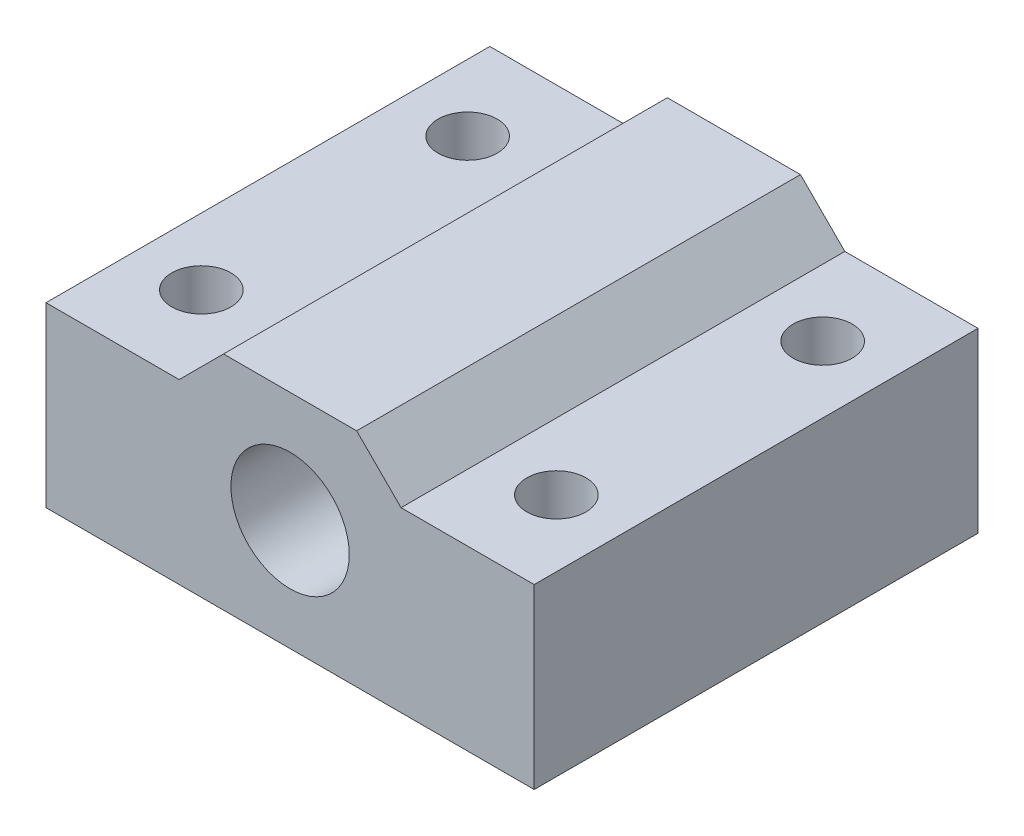
ISO-10303-21;
HEADER;
FILE_DESCRIPTION(('STEP AP214'),'2;1');
FILE_NAME('part.step','',(''),(''),'','','');
FILE_SCHEMA(('AUTOMOTIVE_DESIGN { 1 0 10303 214 1 1 1 1 }'));
ENDSEC;
DATA;
#1=APPLICATION_CONTEXT('core data for automotive mechanical design processes');
#2=APPLICATION_PROTOCOL_DEFINITION('international standard','automotive_design',2000,#1);
#3=PRODUCT_CONTEXT('',#1,'mechanical');
#4=PRODUCT('Part','Part','',(#3));
#5=PRODUCT_RELATED_PRODUCT_CATEGORY('part','',(#4));
#6=PRODUCT_DEFINITION_FORMATION('','',#4);
#7=PRODUCT_DEFINITION_CONTEXT('part definition',#1,'design');
#8=PRODUCT_DEFINITION('design','',#6,#7);
#9=PRODUCT_DEFINITION_SHAPE('','',#8);
#10=(LENGTH_UNIT() NAMED_UNIT(*) SI_UNIT(.MILLI.,.METRE.));
#11=(NAMED_UNIT(*) PLANE_ANGLE_UNIT() SI_UNIT($,.RADIAN.));
#12=(NAMED_UNIT(*) SI_UNIT($,.STERADIAN.) SOLID_ANGLE_UNIT());
#13=UNCERTAINTY_MEASURE_WITH_UNIT(LENGTH_MEASURE(1.E-05),#10,'distance_accuracy_value','');
#14=(GEOMETRIC_REPRESENTATION_CONTEXT(3) GLOBAL_UNCERTAINTY_ASSIGNED_CONTEXT((#13)) GLOBAL_UNIT_ASSIGNED_CONTEXT((#10,
#11,#12)) REPRESENTATION_CONTEXT('',''));
#15=CARTESIAN_POINT('',(0.,0.,0.));
#16=DIRECTION('',(0.,0.,1.));
#17=DIRECTION('',(1.,0.,0.));
#18=AXIS2_PLACEMENT_3D('',#15,#16,#17);
#19=CARTESIAN_POINT('',(16.5,15.,15.));
#20=DIRECTION('',(0.,0.,-1.));
#21=DIRECTION('',(-1.,0.,0.));
#22=AXIS2_PLACEMENT_3D('',#19,#20,#21);
#23=PLANE('',#22);
#24=CARTESIAN_POINT('',(0.,7.5,15.));
#25=DIRECTION('',(0.,0.,1.));
#26=DIRECTION('',(1.,0.,0.));
#27=AXIS2_PLACEMENT_3D('',#24,#25,#26);
#28=CIRCLE('',#27,4.);
#29=CARTESIAN_POINT('',(4.,7.5,15.));
#30=VERTEX_POINT('',#29);
#31=EDGE_CURVE('E142',#30,#30,#28,.T.);
#32=ORIENTED_EDGE('',*,*,#31,.F.);
#33=EDGE_LOOP('',(#32));
#34=FACE_BOUND('',#33,.T.);
#35=DIRECTION('',(-1.,0.,0.));
#36=VECTOR('',#35,1.);
#37=CARTESIAN_POINT('',(16.5,12.,15.));
#38=LINE('',#37,#36);
#39=CARTESIAN_POINT('',(16.5,12.,15.));
#40=VERTEX_POINT('',#39);
#41=CARTESIAN_POINT('',(7.5,12.,15.));
#42=VERTEX_POINT('',#41);
#43=EDGE_CURVE('E119',#40,#42,#38,.T.);
#44=ORIENTED_EDGE('',*,*,#43,.T.);
#45=DIRECTION('',(-0.707106781186546,0.707106781186549,0.));
#46=VECTOR('',#45,1.);
#47=CARTESIAN_POINT('',(7.5,12.,15.));
#48=LINE('',#47,#46);
#49=CARTESIAN_POINT('',(4.50000000000001,15.,15.));
#50=VERTEX_POINT('',#49);
#51=EDGE_CURVE('E112',#42,#50,#48,.T.);
#52=ORIENTED_EDGE('',*,*,#51,.T.);
#53=DIRECTION('',(1.,0.,0.));
#54=VECTOR('',#53,1.);
#55=CARTESIAN_POINT('',(16.5,15.,15.));
#56=LINE('',#55,#54);
#57=CARTESIAN_POINT('',(-4.50000000000001,15.,15.));
#58=VERTEX_POINT('',#57);
#59=EDGE_CURVE('E152',#58,#50,#56,.T.);
#60=ORIENTED_EDGE('',*,*,#59,.F.);
#61=DIRECTION('',(0.707106781186546,0.707106781186549,0.));
#62=VECTOR('',#61,1.);
#63=CARTESIAN_POINT('',(-7.5,12.,15.));
#64=LINE('',#63,#62);
#65=CARTESIAN_POINT('',(-7.5,12.,15.));
#66=VERTEX_POINT('',#65);
#67=EDGE_CURVE('E58',#66,#58,#64,.T.);
#68=ORIENTED_EDGE('',*,*,#67,.F.);
#69=DIRECTION('',(1.,0.,0.));
#70=VECTOR('',#69,1.);
#71=CARTESIAN_POINT('',(-16.5,12.,15.));
#72=LINE('',#71,#70);
#73=CARTESIAN_POINT('',(-16.5,12.,15.));
#74=VERTEX_POINT('',#73);
#75=EDGE_CURVE('E128',#74,#66,#72,.T.);
#76=ORIENTED_EDGE('',*,*,#75,.F.);
#77=DIRECTION('',(0.,-1.,0.));
#78=VECTOR('',#77,1.);
#79=CARTESIAN_POINT('',(-16.5,15.,15.));
#80=LINE('',#79,#78);
#81=CARTESIAN_POINT('',(-16.5,0.,15.));
#82=VERTEX_POINT('',#81);
#83=EDGE_CURVE('E11',#74,#82,#80,.T.);
#84=ORIENTED_EDGE('',*,*,#83,.T.);
#85=DIRECTION('',(1.,0.,0.));
#86=VECTOR('',#85,1.);
#87=CARTESIAN_POINT('',(16.5,0.,15.));
#88=LINE('',#87,#86);
#89=CARTESIAN_POINT('',(16.5,0.,15.));
#90=VERTEX_POINT('',#89);
#91=EDGE_CURVE('E160',#82,#90,#88,.T.);
#92=ORIENTED_EDGE('',*,*,#91,.T.);
#93=DIRECTION('',(0.,-1.,0.));
#94=VECTOR('',#93,1.);
#95=CARTESIAN_POINT('',(16.5,15.,15.));
#96=LINE('',#95,#94);
#97=EDGE_CURVE('E43',#40,#90,#96,.T.);
#98=ORIENTED_EDGE('',*,*,#97,.F.);
#99=EDGE_LOOP('',(#44,#52,#60,#68,#76,#84,#92,#98));
#100=FACE_BOUND('',#99,.T.);
#101=ADVANCED_FACE('F35',(#34,#100),#23,.F.);
#102=CARTESIAN_POINT('',(16.5,15.,-15.));
#103=DIRECTION('',(-1.,0.,0.));
#104=DIRECTION('',(0.,0.,1.));
#105=AXIS2_PLACEMENT_3D('',#102,#103,#104);
#106=PLANE('',#105);
#107=DIRECTION('',(0.,0.,1.));
#108=VECTOR('',#107,1.);
#109=CARTESIAN_POINT('',(16.5,12.,-15.));
#110=LINE('',#109,#108);
#111=CARTESIAN_POINT('',(16.5,12.,-15.));
#112=VERTEX_POINT('',#111);
#113=EDGE_CURVE('E105',#112,#40,#110,.T.);
#114=ORIENTED_EDGE('',*,*,#113,.T.);
#115=ORIENTED_EDGE('',*,*,#97,.T.);
#116=DIRECTION('',(0.,0.,-1.));
#117=VECTOR('',#116,1.);
#118=CARTESIAN_POINT('',(16.5,0.,-15.));
#119=LINE('',#118,#117);
#120=CARTESIAN_POINT('',(16.5,0.,-15.));
#121=VERTEX_POINT('',#120);
#122=EDGE_CURVE('E163',#90,#121,#119,.T.);
#123=ORIENTED_EDGE('',*,*,#122,.T.);
#124=DIRECTION('',(0.,-1.,0.));
#125=VECTOR('',#124,1.);
#126=CARTESIAN_POINT('',(16.5,15.,-15.));
#127=LINE('',#126,#125);
#128=EDGE_CURVE('E169',#112,#121,#127,.T.);
#129=ORIENTED_EDGE('',*,*,#128,.F.);
#130=EDGE_LOOP('',(#114,#115,#123,#129));
#131=FACE_BOUND('',#130,.T.);
#132=ADVANCED_FACE('F172',(#131),#106,.F.);
#133=CARTESIAN_POINT('',(16.5,15.,-15.));
#134=DIRECTION('',(0.,0.,1.));
#135=DIRECTION('',(1.,0.,0.));
#136=AXIS2_PLACEMENT_3D('',#133,#134,#135);
#137=PLANE('',#136);
#138=CARTESIAN_POINT('',(0.,7.5,-15.));
#139=DIRECTION('',(0.,0.,1.));
#140=DIRECTION('',(1.,0.,0.));
#141=AXIS2_PLACEMENT_3D('',#138,#139,#140);
#142=CIRCLE('',#141,4.);
#143=CARTESIAN_POINT('',(4.,7.5,-15.));
#144=VERTEX_POINT('',#143);
#145=EDGE_CURVE('E146',#144,#144,#142,.T.);
#146=ORIENTED_EDGE('',*,*,#145,.T.);
#147=EDGE_LOOP('',(#146));
#148=FACE_BOUND('',#147,.T.);
#149=DIRECTION('',(-1.,0.,0.));
#150=VECTOR('',#149,1.);
#151=CARTESIAN_POINT('',(16.5,12.,-15.));
#152=LINE('',#151,#150);
#153=CARTESIAN_POINT('',(7.5,12.,-15.));
#154=VERTEX_POINT('',#153);
#155=EDGE_CURVE('E100',#112,#154,#152,.T.);
#156=ORIENTED_EDGE('',*,*,#155,.F.);
#157=ORIENTED_EDGE('',*,*,#128,.T.);
#158=DIRECTION('',(-1.,0.,0.));
#159=VECTOR('',#158,1.);
#160=CARTESIAN_POINT('',(16.5,0.,-15.));
#161=LINE('',#160,#159);
#162=CARTESIAN_POINT('',(-16.5,0.,-15.));
#163=VERTEX_POINT('',#162);
#164=EDGE_CURVE('E155',#121,#163,#161,.T.);
#165=ORIENTED_EDGE('',*,*,#164,.T.);
#166=DIRECTION('',(0.,-1.,0.));
#167=VECTOR('',#166,1.);
#168=CARTESIAN_POINT('',(-16.5,15.,-15.));
#169=LINE('',#168,#167);
#170=CARTESIAN_POINT('',(-16.5,12.,-15.));
#171=VERTEX_POINT('',#170);
#172=EDGE_CURVE('E157',#171,#163,#169,.T.);
#173=ORIENTED_EDGE('',*,*,#172,.F.);
#174=DIRECTION('',(1.,0.,0.));
#175=VECTOR('',#174,1.);
#176=CARTESIAN_POINT('',(-16.5,12.,-15.));
#177=LINE('',#176,#175);
#178=CARTESIAN_POINT('',(-7.5,12.,-15.));
#179=VERTEX_POINT('',#178);
#180=EDGE_CURVE('E131',#171,#179,#177,.T.);
#181=ORIENTED_EDGE('',*,*,#180,.T.);
#182=DIRECTION('',(0.707106781186546,0.707106781186549,0.));
#183=VECTOR('',#182,1.);
#184=CARTESIAN_POINT('',(-7.5,12.,-15.));
#185=LINE('',#184,#183);
#186=CARTESIAN_POINT('',(-4.50000000000001,15.,-15.));
#187=VERTEX_POINT('',#186);
#188=EDGE_CURVE('E134',#179,#187,#185,.T.);
#189=ORIENTED_EDGE('',*,*,#188,.T.);
#190=DIRECTION('',(-1.,0.,0.));
#191=VECTOR('',#190,1.);
#192=CARTESIAN_POINT('',(16.5,15.,-15.));
#193=LINE('',#192,#191);
#194=CARTESIAN_POINT('',(4.50000000000001,15.,-15.));
#195=VERTEX_POINT('',#194);
#196=EDGE_CURVE('E118',#195,#187,#193,.T.);
#197=ORIENTED_EDGE('',*,*,#196,.F.);
#198=DIRECTION('',(-0.707106781186546,0.707106781186549,0.));
#199=VECTOR('',#198,1.);
#200=CARTESIAN_POINT('',(7.5,12.,-15.));
#201=LINE('',#200,#199);
#202=EDGE_CURVE('E50',#154,#195,#201,.T.);
#203=ORIENTED_EDGE('',*,*,#202,.F.);
#204=EDGE_LOOP('',(#156,#157,#165,#173,#181,#189,#197,#203));
#205=FACE_BOUND('',#204,.T.);
#206=ADVANCED_FACE('F116',(#148,#205),#137,.F.);
#207=CARTESIAN_POINT('',(0.,15.,0.));
#208=DIRECTION('',(0.,-1.,0.));
#209=DIRECTION('',(0.,0.,-1.));
#210=AXIS2_PLACEMENT_3D('',#207,#208,#209);
#211=PLANE('',#210);
#212=DIRECTION('',(0.,0.,1.));
#213=VECTOR('',#212,1.);
#214=CARTESIAN_POINT('',(4.50000000000001,15.,-15.));
#215=LINE('',#214,#213);
#216=EDGE_CURVE('E108',#195,#50,#215,.T.);
#217=ORIENTED_EDGE('',*,*,#216,.F.);
#218=ORIENTED_EDGE('',*,*,#196,.T.);
#219=DIRECTION('',(0.,0.,1.));
#220=VECTOR('',#219,1.);
#221=CARTESIAN_POINT('',(-4.50000000000001,15.,-15.));
#222=LINE('',#221,#220);
#223=EDGE_CURVE('E140',#187,#58,#222,.T.);
#224=ORIENTED_EDGE('',*,*,#223,.T.);
#225=ORIENTED_EDGE('',*,*,#59,.T.);
#226=EDGE_LOOP('',(#217,#218,#224,#225));
#227=FACE_BOUND('',#226,.T.);
#228=ADVANCED_FACE('F189',(#227),#211,.F.);
#229=CARTESIAN_POINT('',(-16.5,15.,-15.));
#230=DIRECTION('',(1.,0.,0.));
#231=DIRECTION('',(0.,0.,-1.));
#232=AXIS2_PLACEMENT_3D('',#229,#230,#231);
#233=PLANE('',#232);
#234=ORIENTED_EDGE('',*,*,#83,.F.);
#235=DIRECTION('',(0.,0.,1.));
#236=VECTOR('',#235,1.);
#237=CARTESIAN_POINT('',(-16.5,12.,-15.));
#238=LINE('',#237,#236);
#239=EDGE_CURVE('E136',#171,#74,#238,.T.);
#240=ORIENTED_EDGE('',*,*,#239,.F.);
#241=ORIENTED_EDGE('',*,*,#172,.T.);
#242=DIRECTION('',(0.,0.,1.));
#243=VECTOR('',#242,1.);
#244=CARTESIAN_POINT('',(-16.5,0.,-15.));
#245=LINE('',#244,#243);
#246=EDGE_CURVE('E149',#163,#82,#245,.T.);
#247=ORIENTED_EDGE('',*,*,#246,.T.);
#248=EDGE_LOOP('',(#234,#240,#241,#247));
#249=FACE_BOUND('',#248,.T.);
#250=ADVANCED_FACE('F37',(#249),#233,.F.);
#251=CARTESIAN_POINT('',(0.,0.,0.));
#252=DIRECTION('',(0.,-1.,0.));
#253=DIRECTION('',(0.,0.,-1.));
#254=AXIS2_PLACEMENT_3D('',#251,#252,#253);
#255=PLANE('',#254);
#256=CARTESIAN_POINT('',(12.,0.,-9.));
#257=DIRECTION('',(0.,1.,0.));
#258=DIRECTION('',(0.,0.,1.));
#259=AXIS2_PLACEMENT_3D('',#256,#257,#258);
#260=CIRCLE('',#259,2.);
#261=CARTESIAN_POINT('',(12.,0.,-7.));
#262=VERTEX_POINT('',#261);
#263=EDGE_CURVE('E341',#262,#262,#260,.T.);
#264=ORIENTED_EDGE('',*,*,#263,.T.);
#265=EDGE_LOOP('',(#264));
#266=FACE_BOUND('',#265,.T.);
#267=CARTESIAN_POINT('',(-12.,0.,9.));
#268=DIRECTION('',(0.,1.,0.));
#269=DIRECTION('',(0.,0.,1.));
#270=AXIS2_PLACEMENT_3D('',#267,#268,#269);
#271=CIRCLE('',#270,2.);
#272=CARTESIAN_POINT('',(-12.,0.,11.));
#273=VERTEX_POINT('',#272);
#274=EDGE_CURVE('E325',#273,#273,#271,.T.);
#275=ORIENTED_EDGE('',*,*,#274,.T.);
#276=EDGE_LOOP('',(#275));
#277=FACE_BOUND('',#276,.T.);
#278=CARTESIAN_POINT('',(12.,0.,9.));
#279=DIRECTION('',(0.,1.,0.));
#280=DIRECTION('',(0.,0.,1.));
#281=AXIS2_PLACEMENT_3D('',#278,#279,#280);
#282=CIRCLE('',#281,2.);
#283=CARTESIAN_POINT('',(12.,0.,11.));
#284=VERTEX_POINT('',#283);
#285=EDGE_CURVE('E329',#284,#284,#282,.T.);
#286=ORIENTED_EDGE('',*,*,#285,.T.);
#287=EDGE_LOOP('',(#286));
#288=FACE_BOUND('',#287,.T.);
#289=CARTESIAN_POINT('',(-12.,0.,-9.));
#290=DIRECTION('',(0.,1.,0.));
#291=DIRECTION('',(0.,0.,1.));
#292=AXIS2_PLACEMENT_3D('',#289,#290,#291);
#293=CIRCLE('',#292,2.);
#294=CARTESIAN_POINT('',(-12.,0.,-7.));
#295=VERTEX_POINT('',#294);
#296=EDGE_CURVE('E126',#295,#295,#293,.T.);
#297=ORIENTED_EDGE('',*,*,#296,.T.);
#298=EDGE_LOOP('',(#297));
#299=FACE_BOUND('',#298,.T.);
#300=ORIENTED_EDGE('',*,*,#246,.F.);
#301=ORIENTED_EDGE('',*,*,#164,.F.);
#302=ORIENTED_EDGE('',*,*,#122,.F.);
#303=ORIENTED_EDGE('',*,*,#91,.F.);
#304=EDGE_LOOP('',(#300,#301,#302,#303));
#305=FACE_BOUND('',#304,.T.);
#306=ADVANCED_FACE('F181',(#266,#277,#288,#299,#305),#255,.T.);
#307=CARTESIAN_POINT('',(0.,7.5,-15.));
#308=DIRECTION('',(0.,0.,1.));
#309=DIRECTION('',(1.,0.,0.));
#310=AXIS2_PLACEMENT_3D('',#307,#308,#309);
#311=CYLINDRICAL_SURFACE('',#310,4.);
#312=ORIENTED_EDGE('',*,*,#145,.F.);
#313=EDGE_LOOP('',(#312));
#314=FACE_BOUND('',#313,.T.);
#315=ORIENTED_EDGE('',*,*,#31,.T.);
#316=EDGE_LOOP('',(#315));
#317=FACE_BOUND('',#316,.T.);
#318=ADVANCED_FACE('F193',(#314,#317),#311,.F.);
#319=CARTESIAN_POINT('',(-7.5,12.,-15.));
#320=DIRECTION('',(0.707106781186549,-0.707106781186546,0.));
#321=DIRECTION('',(0.707106781186546,0.707106781186549,0.));
#322=AXIS2_PLACEMENT_3D('',#319,#320,#321);
#323=PLANE('',#322);
#324=ORIENTED_EDGE('',*,*,#67,.T.);
#325=ORIENTED_EDGE('',*,*,#223,.F.);
#326=ORIENTED_EDGE('',*,*,#188,.F.);
#327=DIRECTION('',(0.,0.,1.));
#328=VECTOR('',#327,1.);
#329=CARTESIAN_POINT('',(-7.5,12.,-15.));
#330=LINE('',#329,#328);
#331=EDGE_CURVE('E143',#179,#66,#330,.T.);
#332=ORIENTED_EDGE('',*,*,#331,.T.);
#333=EDGE_LOOP('',(#324,#325,#326,#332));
#334=FACE_BOUND('',#333,.T.);
#335=ADVANCED_FACE('F191',(#334),#323,.F.);
#336=CARTESIAN_POINT('',(-16.5,12.,-15.));
#337=DIRECTION('',(0.,-1.,0.));
#338=DIRECTION('',(0.,0.,-1.));
#339=AXIS2_PLACEMENT_3D('',#336,#337,#338);
#340=PLANE('',#339);
#341=CARTESIAN_POINT('',(-12.,12.,9.));
#342=DIRECTION('',(0.,1.,0.));
#343=DIRECTION('',(0.,0.,1.));
#344=AXIS2_PLACEMENT_3D('',#341,#342,#343);
#345=CIRCLE('',#344,2.);
#346=CARTESIAN_POINT('',(-12.,12.,11.));
#347=VERTEX_POINT('',#346);
#348=EDGE_CURVE('E328',#347,#347,#345,.T.);
#349=ORIENTED_EDGE('',*,*,#348,.F.);
#350=EDGE_LOOP('',(#349));
#351=FACE_BOUND('',#350,.T.);
#352=CARTESIAN_POINT('',(-12.,12.,-9.));
#353=DIRECTION('',(0.,1.,0.));
#354=DIRECTION('',(0.,0.,1.));
#355=AXIS2_PLACEMENT_3D('',#352,#353,#354);
#356=CIRCLE('',#355,2.);
#357=CARTESIAN_POINT('',(-12.,12.,-7.));
#358=VERTEX_POINT('',#357);
#359=EDGE_CURVE('E123',#358,#358,#356,.T.);
#360=ORIENTED_EDGE('',*,*,#359,.F.);
#361=EDGE_LOOP('',(#360));
#362=FACE_BOUND('',#361,.T.);
#363=ORIENTED_EDGE('',*,*,#75,.T.);
#364=ORIENTED_EDGE('',*,*,#331,.F.);
#365=ORIENTED_EDGE('',*,*,#180,.F.);
#366=ORIENTED_EDGE('',*,*,#239,.T.);
#367=EDGE_LOOP('',(#363,#364,#365,#366));
#368=FACE_BOUND('',#367,.T.);
#369=ADVANCED_FACE('F186',(#351,#362,#368),#340,.F.);
#370=CARTESIAN_POINT('',(16.5,12.,-15.));
#371=DIRECTION('',(0.,1.,0.));
#372=DIRECTION('',(0.,0.,1.));
#373=AXIS2_PLACEMENT_3D('',#370,#371,#372);
#374=PLANE('',#373);
#375=CARTESIAN_POINT('',(12.,12.,-9.));
#376=DIRECTION('',(0.,1.,0.));
#377=DIRECTION('',(0.,0.,1.));
#378=AXIS2_PLACEMENT_3D('',#375,#376,#377);
#379=CIRCLE('',#378,2.);
#380=CARTESIAN_POINT('',(12.,12.,-7.));
#381=VERTEX_POINT('',#380);
#382=EDGE_CURVE('E331',#381,#381,#379,.T.);
#383=ORIENTED_EDGE('',*,*,#382,.F.);
#384=EDGE_LOOP('',(#383));
#385=FACE_BOUND('',#384,.T.);
#386=CARTESIAN_POINT('',(12.,12.,9.));
#387=DIRECTION('',(0.,1.,0.));
#388=DIRECTION('',(0.,0.,1.));
#389=AXIS2_PLACEMENT_3D('',#386,#387,#388);
#390=CIRCLE('',#389,2.);
#391=CARTESIAN_POINT('',(12.,12.,11.));
#392=VERTEX_POINT('',#391);
#393=EDGE_CURVE('E334',#392,#392,#390,.T.);
#394=ORIENTED_EDGE('',*,*,#393,.F.);
#395=EDGE_LOOP('',(#394));
#396=FACE_BOUND('',#395,.T.);
#397=ORIENTED_EDGE('',*,*,#43,.F.);
#398=ORIENTED_EDGE('',*,*,#113,.F.);
#399=ORIENTED_EDGE('',*,*,#155,.T.);
#400=DIRECTION('',(0.,0.,1.));
#401=VECTOR('',#400,1.);
#402=CARTESIAN_POINT('',(7.5,12.,-15.));
#403=LINE('',#402,#401);
#404=EDGE_CURVE('E102',#154,#42,#403,.T.);
#405=ORIENTED_EDGE('',*,*,#404,.T.);
#406=EDGE_LOOP('',(#397,#398,#399,#405));
#407=FACE_BOUND('',#406,.T.);
#408=ADVANCED_FACE('F101',(#385,#396,#407),#374,.T.);
#409=CARTESIAN_POINT('',(7.5,12.,-15.));
#410=DIRECTION('',(0.707106781186549,0.707106781186546,0.));
#411=DIRECTION('',(-0.707106781186546,0.707106781186549,0.));
#412=AXIS2_PLACEMENT_3D('',#409,#410,#411);
#413=PLANE('',#412);
#414=ORIENTED_EDGE('',*,*,#51,.F.);
#415=ORIENTED_EDGE('',*,*,#404,.F.);
#416=ORIENTED_EDGE('',*,*,#202,.T.);
#417=ORIENTED_EDGE('',*,*,#216,.T.);
#418=EDGE_LOOP('',(#414,#415,#416,#417));
#419=FACE_BOUND('',#418,.T.);
#420=ADVANCED_FACE('F110',(#419),#413,.T.);
#421=CARTESIAN_POINT('',(12.,0.,9.));
#422=DIRECTION('',(0.,1.,0.));
#423=DIRECTION('',(0.,0.,1.));
#424=AXIS2_PLACEMENT_3D('',#421,#422,#423);
#425=CYLINDRICAL_SURFACE('',#424,2.);
#426=ORIENTED_EDGE('',*,*,#285,.F.);
#427=EDGE_LOOP('',(#426));
#428=FACE_BOUND('',#427,.T.);
#429=ORIENTED_EDGE('',*,*,#393,.T.);
#430=EDGE_LOOP('',(#429));
#431=FACE_BOUND('',#430,.T.);
#432=ADVANCED_FACE('F280',(#428,#431),#425,.F.);
#433=CARTESIAN_POINT('',(12.,0.,-9.));
#434=DIRECTION('',(0.,1.,0.));
#435=DIRECTION('',(0.,0.,1.));
#436=AXIS2_PLACEMENT_3D('',#433,#434,#435);
#437=CYLINDRICAL_SURFACE('',#436,2.);
#438=ORIENTED_EDGE('',*,*,#263,.F.);
#439=EDGE_LOOP('',(#438));
#440=FACE_BOUND('',#439,.T.);
#441=ORIENTED_EDGE('',*,*,#382,.T.);
#442=EDGE_LOOP('',(#441));
#443=FACE_BOUND('',#442,.T.);
#444=ADVANCED_FACE('F286',(#440,#443),#437,.F.);
#445=CARTESIAN_POINT('',(-12.,0.,-9.));
#446=DIRECTION('',(0.,1.,0.));
#447=DIRECTION('',(0.,0.,1.));
#448=AXIS2_PLACEMENT_3D('',#445,#446,#447);
#449=CYLINDRICAL_SURFACE('',#448,2.);
#450=ORIENTED_EDGE('',*,*,#296,.F.);
#451=EDGE_LOOP('',(#450));
#452=FACE_BOUND('',#451,.T.);
#453=ORIENTED_EDGE('',*,*,#359,.T.);
#454=EDGE_LOOP('',(#453));
#455=FACE_BOUND('',#454,.T.);
#456=ADVANCED_FACE('F295',(#452,#455),#449,.F.);
#457=CARTESIAN_POINT('',(-12.,0.,9.));
#458=DIRECTION('',(0.,1.,0.));
#459=DIRECTION('',(0.,0.,1.));
#460=AXIS2_PLACEMENT_3D('',#457,#458,#459);
#461=CYLINDRICAL_SURFACE('',#460,2.);
#462=ORIENTED_EDGE('',*,*,#274,.F.);
#463=EDGE_LOOP('',(#462));
#464=FACE_BOUND('',#463,.T.);
#465=ORIENTED_EDGE('',*,*,#348,.T.);
#466=EDGE_LOOP('',(#465));
#467=FACE_BOUND('',#466,.T.);
#468=ADVANCED_FACE('F304',(#464,#467),#461,.F.);
#469=CLOSED_SHELL('',(#101,#132,#206,#228,#250,#306,#318,#335,#369,#408,#420,#432,#444,#456,#468));
#470=MANIFOLD_SOLID_BREP('B2',#469);
#471=ADVANCED_BREP_SHAPE_REPRESENTATION('',(#18,#470),#14);
#472=SHAPE_DEFINITION_REPRESENTATION(#9,#471);
ENDSEC;
END-ISO-10303-21;
